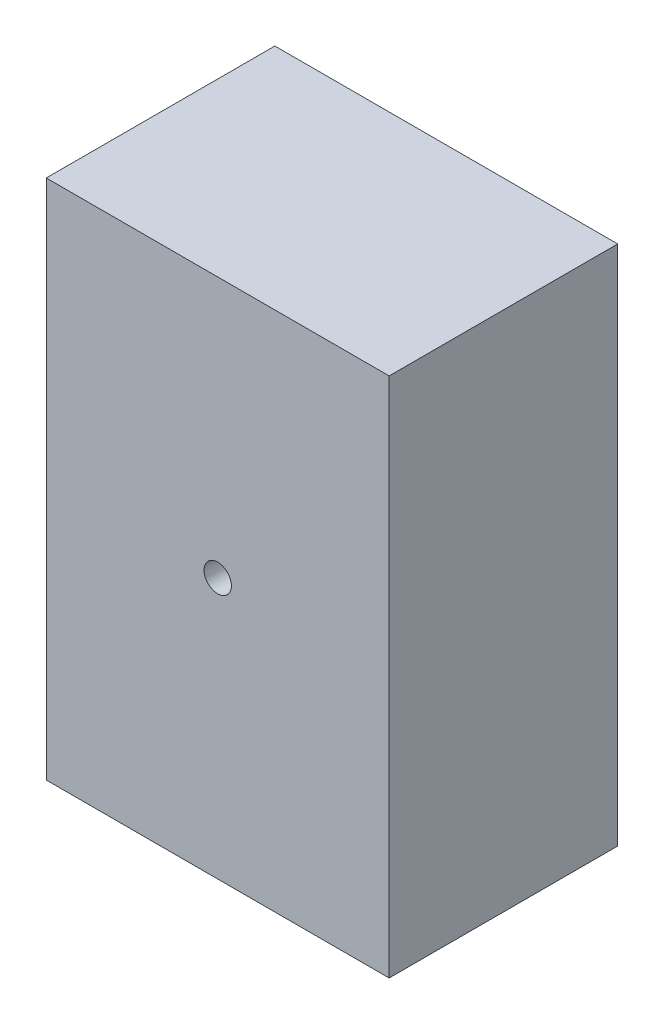
ISO-10303-21;
HEADER;
FILE_DESCRIPTION(('STEP AP214'),'2;1');
FILE_NAME('part.step','',(''),(''),'','','');
FILE_SCHEMA(('AUTOMOTIVE_DESIGN { 1 0 10303 214 1 1 1 1 }'));
ENDSEC;
DATA;
#1=APPLICATION_CONTEXT('core data for automotive mechanical design processes');
#2=APPLICATION_PROTOCOL_DEFINITION('international standard','automotive_design',2000,#1);
#3=PRODUCT_CONTEXT('',#1,'mechanical');
#4=PRODUCT('Part','Part','',(#3));
#5=PRODUCT_RELATED_PRODUCT_CATEGORY('part','',(#4));
#6=PRODUCT_DEFINITION_FORMATION('','',#4);
#7=PRODUCT_DEFINITION_CONTEXT('part definition',#1,'design');
#8=PRODUCT_DEFINITION('design','',#6,#7);
#9=PRODUCT_DEFINITION_SHAPE('','',#8);
#10=(LENGTH_UNIT() NAMED_UNIT(*) SI_UNIT(.MILLI.,.METRE.));
#11=(NAMED_UNIT(*) PLANE_ANGLE_UNIT() SI_UNIT($,.RADIAN.));
#12=(NAMED_UNIT(*) SI_UNIT($,.STERADIAN.) SOLID_ANGLE_UNIT());
#13=UNCERTAINTY_MEASURE_WITH_UNIT(LENGTH_MEASURE(1.E-05),#10,'distance_accuracy_value','');
#14=(GEOMETRIC_REPRESENTATION_CONTEXT(3) GLOBAL_UNCERTAINTY_ASSIGNED_CONTEXT((#13)) GLOBAL_UNIT_ASSIGNED_CONTEXT((#10,
#11,#12)) REPRESENTATION_CONTEXT('',''));
#15=CARTESIAN_POINT('',(0.,0.,0.));
#16=DIRECTION('',(0.,0.,1.));
#17=DIRECTION('',(1.,0.,0.));
#18=AXIS2_PLACEMENT_3D('',#15,#16,#17);
#19=CARTESIAN_POINT('',(-19.05,-28.971875,25.4));
#20=DIRECTION('',(1.,0.,0.));
#21=DIRECTION('',(0.,0.,-1.));
#22=AXIS2_PLACEMENT_3D('',#19,#20,#21);
#23=PLANE('',#22);
#24=DIRECTION('',(0.,-1.,0.));
#25=VECTOR('',#24,1.);
#26=CARTESIAN_POINT('',(-19.05,-28.971875,0.));
#27=LINE('',#26,#25);
#28=CARTESIAN_POINT('',(-19.05,28.971875,0.));
#29=VERTEX_POINT('',#28);
#30=CARTESIAN_POINT('',(-19.05,-28.971875,0.));
#31=VERTEX_POINT('',#30);
#32=EDGE_CURVE('E102',#29,#31,#27,.T.);
#33=ORIENTED_EDGE('',*,*,#32,.T.);
#34=DIRECTION('',(0.,0.,-1.));
#35=VECTOR('',#34,1.);
#36=CARTESIAN_POINT('',(-19.05,-28.971875,25.4));
#37=LINE('',#36,#35);
#38=CARTESIAN_POINT('',(-19.05,-28.971875,25.4));
#39=VERTEX_POINT('',#38);
#40=EDGE_CURVE('E11',#39,#31,#37,.T.);
#41=ORIENTED_EDGE('',*,*,#40,.F.);
#42=DIRECTION('',(0.,-1.,0.));
#43=VECTOR('',#42,1.);
#44=CARTESIAN_POINT('',(-19.05,-28.971875,25.4));
#45=LINE('',#44,#43);
#46=CARTESIAN_POINT('',(-19.05,28.971875,25.4));
#47=VERTEX_POINT('',#46);
#48=EDGE_CURVE('E90',#47,#39,#45,.T.);
#49=ORIENTED_EDGE('',*,*,#48,.F.);
#50=DIRECTION('',(0.,0.,-1.));
#51=VECTOR('',#50,1.);
#52=CARTESIAN_POINT('',(-19.05,28.971875,25.4));
#53=LINE('',#52,#51);
#54=EDGE_CURVE('E98',#47,#29,#53,.T.);
#55=ORIENTED_EDGE('',*,*,#54,.T.);
#56=EDGE_LOOP('',(#33,#41,#49,#55));
#57=FACE_BOUND('',#56,.T.);
#58=ADVANCED_FACE('F39',(#57),#23,.F.);
#59=CARTESIAN_POINT('',(19.05,-28.971875,25.4));
#60=DIRECTION('',(0.,1.,0.));
#61=DIRECTION('',(-1.,0.,0.));
#62=AXIS2_PLACEMENT_3D('',#59,#60,#61);
#63=PLANE('',#62);
#64=DIRECTION('',(1.,0.,0.));
#65=VECTOR('',#64,1.);
#66=CARTESIAN_POINT('',(19.05,-28.971875,0.));
#67=LINE('',#66,#65);
#68=CARTESIAN_POINT('',(19.05,-28.971875,0.));
#69=VERTEX_POINT('',#68);
#70=EDGE_CURVE('E94',#31,#69,#67,.T.);
#71=ORIENTED_EDGE('',*,*,#70,.T.);
#72=DIRECTION('',(0.,0.,-1.));
#73=VECTOR('',#72,1.);
#74=CARTESIAN_POINT('',(19.05,-28.971875,25.4));
#75=LINE('',#74,#73);
#76=CARTESIAN_POINT('',(19.05,-28.971875,25.4));
#77=VERTEX_POINT('',#76);
#78=EDGE_CURVE('E47',#77,#69,#75,.T.);
#79=ORIENTED_EDGE('',*,*,#78,.F.);
#80=DIRECTION('',(1.,0.,0.));
#81=VECTOR('',#80,1.);
#82=CARTESIAN_POINT('',(19.05,-28.971875,25.4));
#83=LINE('',#82,#81);
#84=EDGE_CURVE('E85',#39,#77,#83,.T.);
#85=ORIENTED_EDGE('',*,*,#84,.F.);
#86=ORIENTED_EDGE('',*,*,#40,.T.);
#87=EDGE_LOOP('',(#71,#79,#85,#86));
#88=FACE_BOUND('',#87,.T.);
#89=ADVANCED_FACE('F93',(#88),#63,.F.);
#90=CARTESIAN_POINT('',(19.05,-28.971875,25.4));
#91=DIRECTION('',(-1.,0.,0.));
#92=DIRECTION('',(0.,0.,1.));
#93=AXIS2_PLACEMENT_3D('',#90,#91,#92);
#94=PLANE('',#93);
#95=DIRECTION('',(0.,1.,0.));
#96=VECTOR('',#95,1.);
#97=CARTESIAN_POINT('',(19.05,-28.971875,0.));
#98=LINE('',#97,#96);
#99=CARTESIAN_POINT('',(19.05,28.971875,0.));
#100=VERTEX_POINT('',#99);
#101=EDGE_CURVE('E72',#69,#100,#98,.T.);
#102=ORIENTED_EDGE('',*,*,#101,.T.);
#103=DIRECTION('',(0.,0.,-1.));
#104=VECTOR('',#103,1.);
#105=CARTESIAN_POINT('',(19.05,28.971875,25.4));
#106=LINE('',#105,#104);
#107=CARTESIAN_POINT('',(19.05,28.971875,25.4));
#108=VERTEX_POINT('',#107);
#109=EDGE_CURVE('E95',#108,#100,#106,.T.);
#110=ORIENTED_EDGE('',*,*,#109,.F.);
#111=DIRECTION('',(0.,1.,0.));
#112=VECTOR('',#111,1.);
#113=CARTESIAN_POINT('',(19.05,-28.971875,25.4));
#114=LINE('',#113,#112);
#115=EDGE_CURVE('E88',#77,#108,#114,.T.);
#116=ORIENTED_EDGE('',*,*,#115,.F.);
#117=ORIENTED_EDGE('',*,*,#78,.T.);
#118=EDGE_LOOP('',(#102,#110,#116,#117));
#119=FACE_BOUND('',#118,.T.);
#120=ADVANCED_FACE('F96',(#119),#94,.F.);
#121=CARTESIAN_POINT('',(19.05,28.971875,25.4));
#122=DIRECTION('',(0.,-1.,0.));
#123=DIRECTION('',(1.,0.,0.));
#124=AXIS2_PLACEMENT_3D('',#121,#122,#123);
#125=PLANE('',#124);
#126=DIRECTION('',(-1.,0.,0.));
#127=VECTOR('',#126,1.);
#128=CARTESIAN_POINT('',(19.05,28.971875,0.));
#129=LINE('',#128,#127);
#130=EDGE_CURVE('E78',#100,#29,#129,.T.);
#131=ORIENTED_EDGE('',*,*,#130,.T.);
#132=ORIENTED_EDGE('',*,*,#54,.F.);
#133=DIRECTION('',(-1.,0.,0.));
#134=VECTOR('',#133,1.);
#135=CARTESIAN_POINT('',(19.05,28.971875,25.4));
#136=LINE('',#135,#134);
#137=EDGE_CURVE('E55',#108,#47,#136,.T.);
#138=ORIENTED_EDGE('',*,*,#137,.F.);
#139=ORIENTED_EDGE('',*,*,#109,.T.);
#140=EDGE_LOOP('',(#131,#132,#138,#139));
#141=FACE_BOUND('',#140,.T.);
#142=ADVANCED_FACE('F110',(#141),#125,.F.);
#143=CARTESIAN_POINT('',(0.,0.,25.4));
#144=DIRECTION('',(0.,0.,1.));
#145=DIRECTION('',(1.,0.,0.));
#146=AXIS2_PLACEMENT_3D('',#143,#144,#145);
#147=PLANE('',#146);
#148=CARTESIAN_POINT('',(0.,0.,25.4));
#149=DIRECTION('',(0.,0.,1.));
#150=DIRECTION('',(1.,0.,0.));
#151=AXIS2_PLACEMENT_3D('',#148,#149,#150);
#152=CIRCLE('',#151,1.52);
#153=CARTESIAN_POINT('',(1.52,0.,25.4));
#154=VERTEX_POINT('',#153);
#155=EDGE_CURVE('E116',#154,#154,#152,.T.);
#156=ORIENTED_EDGE('',*,*,#155,.F.);
#157=EDGE_LOOP('',(#156));
#158=FACE_BOUND('',#157,.T.);
#159=ORIENTED_EDGE('',*,*,#48,.T.);
#160=ORIENTED_EDGE('',*,*,#84,.T.);
#161=ORIENTED_EDGE('',*,*,#115,.T.);
#162=ORIENTED_EDGE('',*,*,#137,.T.);
#163=EDGE_LOOP('',(#159,#160,#161,#162));
#164=FACE_BOUND('',#163,.T.);
#165=ADVANCED_FACE('F86',(#158,#164),#147,.T.);
#166=CARTESIAN_POINT('',(0.,0.,0.));
#167=DIRECTION('',(0.,0.,1.));
#168=DIRECTION('',(1.,0.,0.));
#169=AXIS2_PLACEMENT_3D('',#166,#167,#168);
#170=PLANE('',#169);
#171=CARTESIAN_POINT('',(0.,0.,0.));
#172=DIRECTION('',(0.,0.,1.));
#173=DIRECTION('',(1.,0.,0.));
#174=AXIS2_PLACEMENT_3D('',#171,#172,#173);
#175=CIRCLE('',#174,1.52);
#176=CARTESIAN_POINT('',(1.52,0.,0.));
#177=VERTEX_POINT('',#176);
#178=EDGE_CURVE('E105',#177,#177,#175,.T.);
#179=ORIENTED_EDGE('',*,*,#178,.T.);
#180=EDGE_LOOP('',(#179));
#181=FACE_BOUND('',#180,.T.);
#182=ORIENTED_EDGE('',*,*,#32,.F.);
#183=ORIENTED_EDGE('',*,*,#130,.F.);
#184=ORIENTED_EDGE('',*,*,#101,.F.);
#185=ORIENTED_EDGE('',*,*,#70,.F.);
#186=EDGE_LOOP('',(#182,#183,#184,#185));
#187=FACE_BOUND('',#186,.T.);
#188=ADVANCED_FACE('F113',(#181,#187),#170,.F.);
#189=CARTESIAN_POINT('',(0.,0.,0.));
#190=DIRECTION('',(0.,0.,1.));
#191=DIRECTION('',(1.,0.,0.));
#192=AXIS2_PLACEMENT_3D('',#189,#190,#191);
#193=CYLINDRICAL_SURFACE('',#192,1.52);
#194=ORIENTED_EDGE('',*,*,#178,.F.);
#195=EDGE_LOOP('',(#194));
#196=FACE_BOUND('',#195,.T.);
#197=ORIENTED_EDGE('',*,*,#155,.T.);
#198=EDGE_LOOP('',(#197));
#199=FACE_BOUND('',#198,.T.);
#200=ADVANCED_FACE('F123',(#196,#199),#193,.F.);
#201=CLOSED_SHELL('',(#58,#89,#120,#142,#165,#188,#200));
#202=MANIFOLD_SOLID_BREP('B2',#201);
#203=ADVANCED_BREP_SHAPE_REPRESENTATION('',(#18,#202),#14);
#204=SHAPE_DEFINITION_REPRESENTATION(#9,#203);
ENDSEC;
END-ISO-10303-21;
